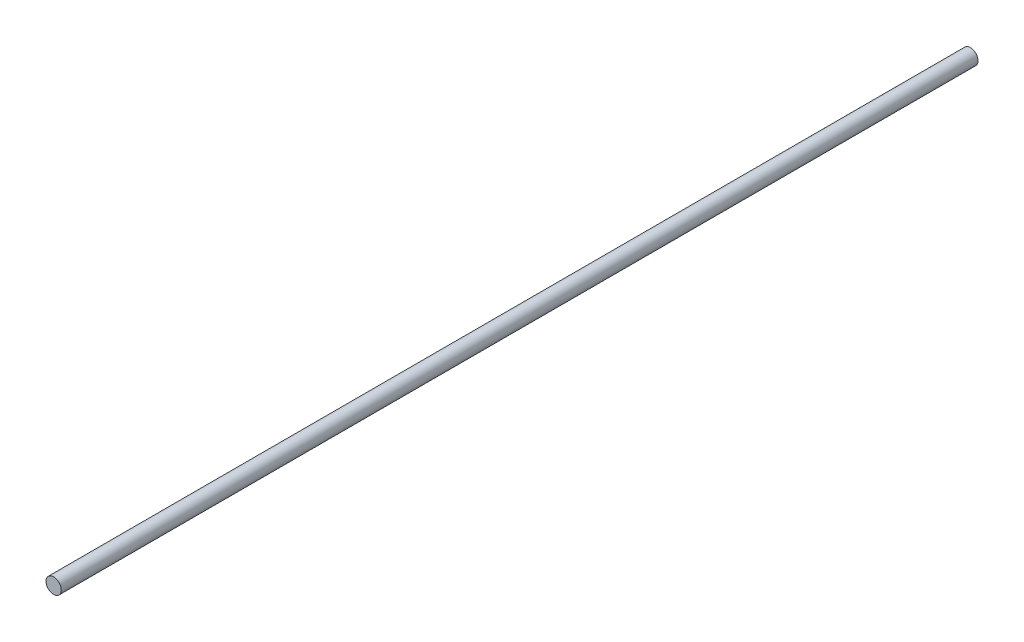
ISO-10303-21;
HEADER;
FILE_DESCRIPTION(('STEP AP214'),'2;1');
FILE_NAME('part.step','',(''),(''),'','','');
FILE_SCHEMA(('AUTOMOTIVE_DESIGN { 1 0 10303 214 1 1 1 1 }'));
ENDSEC;
DATA;
#1=APPLICATION_CONTEXT('core data for automotive mechanical design processes');
#2=APPLICATION_PROTOCOL_DEFINITION('international standard','automotive_design',2000,#1);
#3=PRODUCT_CONTEXT('',#1,'mechanical');
#4=PRODUCT('Part','Part','',(#3));
#5=PRODUCT_RELATED_PRODUCT_CATEGORY('part','',(#4));
#6=PRODUCT_DEFINITION_FORMATION('','',#4);
#7=PRODUCT_DEFINITION_CONTEXT('part definition',#1,'design');
#8=PRODUCT_DEFINITION('design','',#6,#7);
#9=PRODUCT_DEFINITION_SHAPE('','',#8);
#10=(LENGTH_UNIT() NAMED_UNIT(*) SI_UNIT(.MILLI.,.METRE.));
#11=(NAMED_UNIT(*) PLANE_ANGLE_UNIT() SI_UNIT($,.RADIAN.));
#12=(NAMED_UNIT(*) SI_UNIT($,.STERADIAN.) SOLID_ANGLE_UNIT());
#13=UNCERTAINTY_MEASURE_WITH_UNIT(LENGTH_MEASURE(1.E-05),#10,'distance_accuracy_value','');
#14=(GEOMETRIC_REPRESENTATION_CONTEXT(3) GLOBAL_UNCERTAINTY_ASSIGNED_CONTEXT((#13)) GLOBAL_UNIT_ASSIGNED_CONTEXT((#10,
#11,#12)) REPRESENTATION_CONTEXT('',''));
#15=CARTESIAN_POINT('',(0.,0.,0.));
#16=DIRECTION('',(0.,0.,1.));
#17=DIRECTION('',(1.,0.,0.));
#18=AXIS2_PLACEMENT_3D('',#15,#16,#17);
#19=CARTESIAN_POINT('',(0.,0.,381.000000000002));
#20=DIRECTION('',(0.,0.,-1.00000000000001));
#21=DIRECTION('',(-1.,0.,0.));
#22=AXIS2_PLACEMENT_3D('',#19,#20,#21);
#23=CYLINDRICAL_SURFACE('',#22,3.175);
#24=CARTESIAN_POINT('',(0.,0.,381.000000000002));
#25=DIRECTION('',(0.,0.,1.00000000000001));
#26=DIRECTION('',(1.,0.,0.));
#27=AXIS2_PLACEMENT_3D('',#24,#25,#26);
#28=CIRCLE('',#27,3.175);
#29=CARTESIAN_POINT('',(3.175,0.,381.000000000002));
#30=VERTEX_POINT('',#29);
#31=EDGE_CURVE('E10',#30,#30,#28,.T.);
#32=ORIENTED_EDGE('',*,*,#31,.F.);
#33=EDGE_LOOP('',(#32));
#34=FACE_BOUND('',#33,.T.);
#35=CARTESIAN_POINT('',(0.,0.,0.));
#36=DIRECTION('',(0.,0.,1.00000000000001));
#37=DIRECTION('',(1.,0.,0.));
#38=AXIS2_PLACEMENT_3D('',#35,#36,#37);
#39=CIRCLE('',#38,3.175);
#40=CARTESIAN_POINT('',(3.17500000000002,0.,0.));
#41=VERTEX_POINT('',#40);
#42=EDGE_CURVE('E30',#41,#41,#39,.T.);
#43=ORIENTED_EDGE('',*,*,#42,.T.);
#44=EDGE_LOOP('',(#43));
#45=FACE_BOUND('',#44,.T.);
#46=ADVANCED_FACE('F27',(#34,#45),#23,.T.);
#47=CARTESIAN_POINT('',(0.,0.,381.000000000002));
#48=DIRECTION('',(0.,0.,1.00000000000001));
#49=DIRECTION('',(1.,0.,0.));
#50=AXIS2_PLACEMENT_3D('',#47,#48,#49);
#51=PLANE('',#50);
#52=ORIENTED_EDGE('',*,*,#31,.T.);
#53=EDGE_LOOP('',(#52));
#54=FACE_BOUND('',#53,.T.);
#55=ADVANCED_FACE('F42',(#54),#51,.T.);
#56=CARTESIAN_POINT('',(0.,0.,0.));
#57=DIRECTION('',(0.,0.,1.00000000000001));
#58=DIRECTION('',(1.,0.,0.));
#59=AXIS2_PLACEMENT_3D('',#56,#57,#58);
#60=PLANE('',#59);
#61=ORIENTED_EDGE('',*,*,#42,.F.);
#62=EDGE_LOOP('',(#61));
#63=FACE_BOUND('',#62,.T.);
#64=ADVANCED_FACE('F40',(#63),#60,.F.);
#65=CLOSED_SHELL('',(#46,#55,#64));
#66=MANIFOLD_SOLID_BREP('B2',#65);
#67=ADVANCED_BREP_SHAPE_REPRESENTATION('',(#18,#66),#14);
#68=SHAPE_DEFINITION_REPRESENTATION(#9,#67);
ENDSEC;
END-ISO-10303-21;
